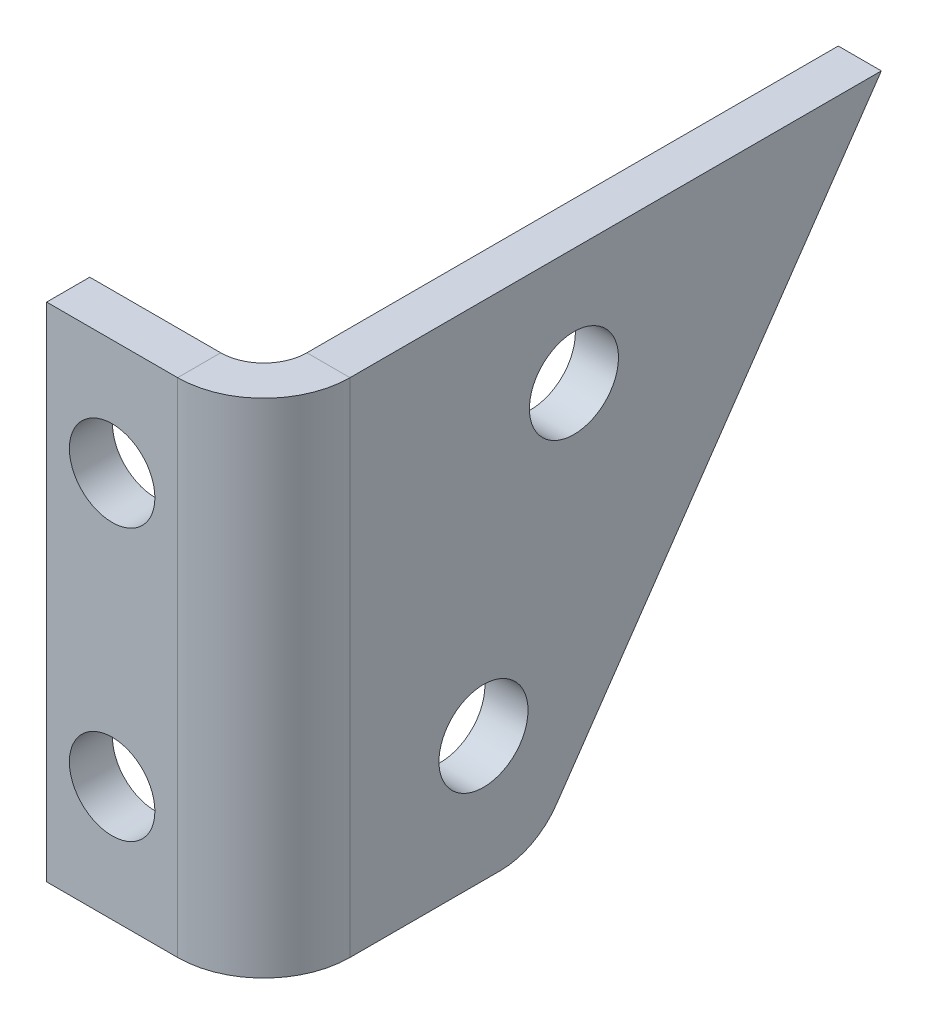
ISO-10303-21;
HEADER;
FILE_DESCRIPTION(('STEP AP214'),'2;1');
FILE_NAME('part.step','',(''),(''),'','','');
FILE_SCHEMA(('AUTOMOTIVE_DESIGN { 1 0 10303 214 1 1 1 1 }'));
ENDSEC;
DATA;
#1=APPLICATION_CONTEXT('core data for automotive mechanical design processes');
#2=APPLICATION_PROTOCOL_DEFINITION('international standard','automotive_design',2000,#1);
#3=PRODUCT_CONTEXT('',#1,'mechanical');
#4=PRODUCT('Part','Part','',(#3));
#5=PRODUCT_RELATED_PRODUCT_CATEGORY('part','',(#4));
#6=PRODUCT_DEFINITION_FORMATION('','',#4);
#7=PRODUCT_DEFINITION_CONTEXT('part definition',#1,'design');
#8=PRODUCT_DEFINITION('design','',#6,#7);
#9=PRODUCT_DEFINITION_SHAPE('','',#8);
#10=(LENGTH_UNIT() NAMED_UNIT(*) SI_UNIT(.MILLI.,.METRE.));
#11=(NAMED_UNIT(*) PLANE_ANGLE_UNIT() SI_UNIT($,.RADIAN.));
#12=(NAMED_UNIT(*) SI_UNIT($,.STERADIAN.) SOLID_ANGLE_UNIT());
#13=UNCERTAINTY_MEASURE_WITH_UNIT(LENGTH_MEASURE(1.E-05),#10,'distance_accuracy_value','');
#14=(GEOMETRIC_REPRESENTATION_CONTEXT(3) GLOBAL_UNCERTAINTY_ASSIGNED_CONTEXT((#13)) GLOBAL_UNIT_ASSIGNED_CONTEXT((#10,
#11,#12)) REPRESENTATION_CONTEXT('',''));
#15=CARTESIAN_POINT('',(0.,0.,0.));
#16=DIRECTION('',(0.,0.,1.));
#17=DIRECTION('',(1.,0.,0.));
#18=AXIS2_PLACEMENT_3D('',#15,#16,#17);
#19=CARTESIAN_POINT('',(-3.175,37.,-50.1590545460921));
#20=DIRECTION('',(0.,1.,0.));
#21=DIRECTION('',(0.,0.,1.));
#22=AXIS2_PLACEMENT_3D('',#19,#20,#21);
#23=PLANE('',#22);
#24=DIRECTION('',(0.,0.,1.));
#25=VECTOR('',#24,1.);
#26=CARTESIAN_POINT('',(-3.175,37.,-50.1590545460921));
#27=LINE('',#26,#25);
#28=CARTESIAN_POINT('',(-3.175,37.,-95.6605073025976));
#29=VERTEX_POINT('',#28);
#30=CARTESIAN_POINT('',(-3.17499999999999,37.,-56.5090545460921));
#31=VERTEX_POINT('',#30);
#32=EDGE_CURVE('E228',#29,#31,#27,.T.);
#33=ORIENTED_EDGE('',*,*,#32,.T.);
#34=DIRECTION('',(1.,0.,0.));
#35=VECTOR('',#34,1.);
#36=CARTESIAN_POINT('',(-3.17499999999999,37.,-56.5090545460921));
#37=LINE('',#36,#35);
#38=CARTESIAN_POINT('',(0.,37.,-56.5090545460921));
#39=VERTEX_POINT('',#38);
#40=EDGE_CURVE('E198',#31,#39,#37,.T.);
#41=ORIENTED_EDGE('',*,*,#40,.T.);
#42=DIRECTION('',(0.,0.,1.));
#43=VECTOR('',#42,1.);
#44=CARTESIAN_POINT('',(0.,37.,-50.1590545460921));
#45=LINE('',#44,#43);
#46=CARTESIAN_POINT('',(0.,37.,-95.6605073025976));
#47=VERTEX_POINT('',#46);
#48=EDGE_CURVE('E223',#47,#39,#45,.T.);
#49=ORIENTED_EDGE('',*,*,#48,.F.);
#50=DIRECTION('',(1.,0.,0.));
#51=VECTOR('',#50,1.);
#52=CARTESIAN_POINT('',(-3.175,37.,-95.6605073025976));
#53=LINE('',#52,#51);
#54=EDGE_CURVE('E13',#29,#47,#53,.T.);
#55=ORIENTED_EDGE('',*,*,#54,.F.);
#56=EDGE_LOOP('',(#33,#41,#49,#55));
#57=FACE_BOUND('',#56,.T.);
#58=ADVANCED_FACE('F63',(#57),#23,.T.);
#59=CARTESIAN_POINT('',(-3.175,5.00000000000016,-67.5979092718288));
#60=DIRECTION('',(1.,0.,0.));
#61=DIRECTION('',(0.,0.,-1.));
#62=AXIS2_PLACEMENT_3D('',#59,#60,#61);
#63=PLANE('',#62);
#64=CARTESIAN_POINT('',(-3.175,28.4055664108271,-73.0098549934206));
#65=DIRECTION('',(1.,0.,0.));
#66=DIRECTION('',(0.,0.,-1.));
#67=AXIS2_PLACEMENT_3D('',#64,#65,#66);
#68=CIRCLE('',#67,3.28245761780859);
#69=CARTESIAN_POINT('',(-3.175,28.4055664108271,-76.2923126112292));
#70=VERTEX_POINT('',#69);
#71=EDGE_CURVE('E215',#70,#70,#68,.T.);
#72=ORIENTED_EDGE('',*,*,#71,.T.);
#73=EDGE_LOOP('',(#72));
#74=FACE_BOUND('',#73,.T.);
#75=CARTESIAN_POINT('',(-3.175,9.22229452648841,-66.344990454787));
#76=DIRECTION('',(1.,0.,0.));
#77=DIRECTION('',(0.,0.,-1.));
#78=AXIS2_PLACEMENT_3D('',#75,#76,#77);
#79=CIRCLE('',#78,3.28245761780857);
#80=CARTESIAN_POINT('',(-3.175,9.22229452648841,-69.6274480725955));
#81=VERTEX_POINT('',#80);
#82=EDGE_CURVE('E209',#81,#81,#79,.T.);
#83=ORIENTED_EDGE('',*,*,#82,.T.);
#84=EDGE_LOOP('',(#83));
#85=FACE_BOUND('',#84,.T.);
#86=DIRECTION('',(0.,1.,0.));
#87=VECTOR('',#86,1.);
#88=CARTESIAN_POINT('',(-3.17499999999999,37.,-56.5090545460921));
#89=LINE('',#88,#87);
#90=CARTESIAN_POINT('',(-3.17499999999999,0.,-56.5090545460921));
#91=VERTEX_POINT('',#90);
#92=EDGE_CURVE('E202',#31,#91,#89,.F.);
#93=ORIENTED_EDGE('',*,*,#92,.F.);
#94=ORIENTED_EDGE('',*,*,#32,.F.);
#95=DIRECTION('',(0.,0.824097746308315,-0.566447618522274));
#96=VECTOR('',#95,1.);
#97=CARTESIAN_POINT('',(-3.175,2.16776190738873,-71.7183980033704));
#98=LINE('',#97,#96);
#99=CARTESIAN_POINT('',(-3.175,2.16776190738873,-71.7183980033704));
#100=VERTEX_POINT('',#99);
#101=EDGE_CURVE('E226',#100,#29,#98,.T.);
#102=ORIENTED_EDGE('',*,*,#101,.F.);
#103=CARTESIAN_POINT('',(-3.175,5.00000000000016,-67.5979092718288));
#104=DIRECTION('',(1.,0.,0.));
#105=DIRECTION('',(0.,0.,-1.));
#106=AXIS2_PLACEMENT_3D('',#103,#104,#105);
#107=CIRCLE('',#106,5.00000000000001);
#108=CARTESIAN_POINT('',(-3.175,1.47451495458029E-13,-67.5979092718288));
#109=VERTEX_POINT('',#108);
#110=EDGE_CURVE('E222',#109,#100,#107,.T.);
#111=ORIENTED_EDGE('',*,*,#110,.F.);
#112=DIRECTION('',(0.,0.,-1.));
#113=VECTOR('',#112,1.);
#114=CARTESIAN_POINT('',(-3.175,0.,-50.1590545460921));
#115=LINE('',#114,#113);
#116=EDGE_CURVE('E109',#91,#109,#115,.T.);
#117=ORIENTED_EDGE('',*,*,#116,.F.);
#118=EDGE_LOOP('',(#93,#94,#102,#111,#117));
#119=FACE_BOUND('',#118,.T.);
#120=ADVANCED_FACE('F251',(#74,#85,#119),#63,.F.);
#121=CARTESIAN_POINT('',(0.,5.00000000000016,-67.5979092718288));
#122=DIRECTION('',(1.,0.,0.));
#123=DIRECTION('',(0.,0.,-1.));
#124=AXIS2_PLACEMENT_3D('',#121,#122,#123);
#125=PLANE('',#124);
#126=CARTESIAN_POINT('',(0.,9.22229452648841,-66.344990454787));
#127=DIRECTION('',(1.,0.,0.));
#128=DIRECTION('',(0.,0.,-1.));
#129=AXIS2_PLACEMENT_3D('',#126,#127,#128);
#130=CIRCLE('',#129,3.28245761780857);
#131=CARTESIAN_POINT('',(0.,9.22229452648841,-69.6274480725955));
#132=VERTEX_POINT('',#131);
#133=EDGE_CURVE('E207',#132,#132,#130,.T.);
#134=ORIENTED_EDGE('',*,*,#133,.F.);
#135=EDGE_LOOP('',(#134));
#136=FACE_BOUND('',#135,.T.);
#137=CARTESIAN_POINT('',(0.,28.4055664108271,-73.0098549934206));
#138=DIRECTION('',(1.,0.,0.));
#139=DIRECTION('',(0.,0.,-1.));
#140=AXIS2_PLACEMENT_3D('',#137,#138,#139);
#141=CIRCLE('',#140,3.28245761780859);
#142=CARTESIAN_POINT('',(0.,28.4055664108271,-76.2923126112292));
#143=VERTEX_POINT('',#142);
#144=EDGE_CURVE('E212',#143,#143,#141,.T.);
#145=ORIENTED_EDGE('',*,*,#144,.F.);
#146=EDGE_LOOP('',(#145));
#147=FACE_BOUND('',#146,.T.);
#148=ORIENTED_EDGE('',*,*,#48,.T.);
#149=DIRECTION('',(0.,1.,0.));
#150=VECTOR('',#149,1.);
#151=CARTESIAN_POINT('',(0.,37.,-56.5090545460921));
#152=LINE('',#151,#150);
#153=CARTESIAN_POINT('',(0.,0.,-56.5090545460921));
#154=VERTEX_POINT('',#153);
#155=EDGE_CURVE('E148',#39,#154,#152,.F.);
#156=ORIENTED_EDGE('',*,*,#155,.T.);
#157=DIRECTION('',(0.,0.,-1.));
#158=VECTOR('',#157,1.);
#159=CARTESIAN_POINT('',(0.,0.,-50.1590545460921));
#160=LINE('',#159,#158);
#161=CARTESIAN_POINT('',(0.,1.47451495458029E-13,-67.5979092718288));
#162=VERTEX_POINT('',#161);
#163=EDGE_CURVE('E218',#154,#162,#160,.T.);
#164=ORIENTED_EDGE('',*,*,#163,.T.);
#165=CARTESIAN_POINT('',(0.,5.00000000000016,-67.5979092718288));
#166=DIRECTION('',(1.,0.,0.));
#167=DIRECTION('',(0.,0.,-1.));
#168=AXIS2_PLACEMENT_3D('',#165,#166,#167);
#169=CIRCLE('',#168,5.00000000000001);
#170=CARTESIAN_POINT('',(0.,2.16776190738873,-71.7183980033704));
#171=VERTEX_POINT('',#170);
#172=EDGE_CURVE('E231',#162,#171,#169,.T.);
#173=ORIENTED_EDGE('',*,*,#172,.T.);
#174=DIRECTION('',(0.,0.824097746308315,-0.566447618522274));
#175=VECTOR('',#174,1.);
#176=CARTESIAN_POINT('',(0.,2.16776190738873,-71.7183980033704));
#177=LINE('',#176,#175);
#178=EDGE_CURVE('E234',#171,#47,#177,.T.);
#179=ORIENTED_EDGE('',*,*,#178,.T.);
#180=EDGE_LOOP('',(#148,#156,#164,#173,#179));
#181=FACE_BOUND('',#180,.T.);
#182=ADVANCED_FACE('F244',(#136,#147,#181),#125,.T.);
#183=CARTESIAN_POINT('',(-3.175,0.,-50.1590545460921));
#184=DIRECTION('',(0.,-1.,0.));
#185=DIRECTION('',(0.,0.,-1.));
#186=AXIS2_PLACEMENT_3D('',#183,#184,#185);
#187=PLANE('',#186);
#188=DIRECTION('',(1.,0.,0.));
#189=VECTOR('',#188,1.);
#190=CARTESIAN_POINT('',(-3.17499999999999,0.,-56.5090545460921));
#191=LINE('',#190,#189);
#192=EDGE_CURVE('E205',#91,#154,#191,.T.);
#193=ORIENTED_EDGE('',*,*,#192,.F.);
#194=ORIENTED_EDGE('',*,*,#116,.T.);
#195=DIRECTION('',(1.,0.,0.));
#196=VECTOR('',#195,1.);
#197=CARTESIAN_POINT('',(-3.175,1.47451495458029E-13,-67.5979092718288));
#198=LINE('',#197,#196);
#199=EDGE_CURVE('E67',#109,#162,#198,.T.);
#200=ORIENTED_EDGE('',*,*,#199,.T.);
#201=ORIENTED_EDGE('',*,*,#163,.F.);
#202=EDGE_LOOP('',(#193,#194,#200,#201));
#203=FACE_BOUND('',#202,.T.);
#204=ADVANCED_FACE('F65',(#203),#187,.T.);
#205=CARTESIAN_POINT('',(-3.175,2.16776190738873,-71.7183980033704));
#206=DIRECTION('',(0.,-0.566447618522274,-0.824097746308315));
#207=DIRECTION('',(0.,0.824097746308315,-0.566447618522274));
#208=AXIS2_PLACEMENT_3D('',#205,#206,#207);
#209=PLANE('',#208);
#210=ORIENTED_EDGE('',*,*,#178,.F.);
#211=DIRECTION('',(1.,0.,0.));
#212=VECTOR('',#211,1.);
#213=CARTESIAN_POINT('',(-3.175,2.16776190738873,-71.7183980033704));
#214=LINE('',#213,#212);
#215=EDGE_CURVE('E72',#100,#171,#214,.T.);
#216=ORIENTED_EDGE('',*,*,#215,.F.);
#217=ORIENTED_EDGE('',*,*,#101,.T.);
#218=ORIENTED_EDGE('',*,*,#54,.T.);
#219=EDGE_LOOP('',(#210,#216,#217,#218));
#220=FACE_BOUND('',#219,.T.);
#221=ADVANCED_FACE('F253',(#220),#209,.T.);
#222=CARTESIAN_POINT('',(-3.175,5.00000000000016,-67.5979092718288));
#223=DIRECTION('',(1.,0.,0.));
#224=DIRECTION('',(0.,0.,-1.));
#225=AXIS2_PLACEMENT_3D('',#222,#223,#224);
#226=CYLINDRICAL_SURFACE('',#225,5.00000000000001);
#227=ORIENTED_EDGE('',*,*,#172,.F.);
#228=ORIENTED_EDGE('',*,*,#199,.F.);
#229=ORIENTED_EDGE('',*,*,#110,.T.);
#230=ORIENTED_EDGE('',*,*,#215,.T.);
#231=EDGE_LOOP('',(#227,#228,#229,#230));
#232=FACE_BOUND('',#231,.T.);
#233=ADVANCED_FACE('F242',(#232),#226,.T.);
#234=CARTESIAN_POINT('',(-3.175,28.4055664108271,-73.0098549934206));
#235=DIRECTION('',(1.,0.,0.));
#236=DIRECTION('',(0.,0.,-1.));
#237=AXIS2_PLACEMENT_3D('',#234,#235,#236);
#238=CYLINDRICAL_SURFACE('',#237,3.28245761780859);
#239=ORIENTED_EDGE('',*,*,#71,.F.);
#240=EDGE_LOOP('',(#239));
#241=FACE_BOUND('',#240,.T.);
#242=ORIENTED_EDGE('',*,*,#144,.T.);
#243=EDGE_LOOP('',(#242));
#244=FACE_BOUND('',#243,.T.);
#245=ADVANCED_FACE('F259',(#241,#244),#238,.F.);
#246=CARTESIAN_POINT('',(-3.175,9.22229452648841,-66.344990454787));
#247=DIRECTION('',(1.,0.,0.));
#248=DIRECTION('',(0.,0.,-1.));
#249=AXIS2_PLACEMENT_3D('',#246,#247,#248);
#250=CYLINDRICAL_SURFACE('',#249,3.28245761780857);
#251=ORIENTED_EDGE('',*,*,#82,.F.);
#252=EDGE_LOOP('',(#251));
#253=FACE_BOUND('',#252,.T.);
#254=ORIENTED_EDGE('',*,*,#133,.T.);
#255=EDGE_LOOP('',(#254));
#256=FACE_BOUND('',#255,.T.);
#257=ADVANCED_FACE('F275',(#253,#256),#250,.F.);
#258=CARTESIAN_POINT('',(-6.34999999999999,0.,-56.5090545460921));
#259=DIRECTION('',(0.,-1.,0.));
#260=DIRECTION('',(0.,0.,-1.));
#261=AXIS2_PLACEMENT_3D('',#258,#259,#260);
#262=PLANE('',#261);
#263=DIRECTION('',(0.,0.,1.));
#264=VECTOR('',#263,1.);
#265=CARTESIAN_POINT('',(-6.34999999999999,0.,-50.159054546092));
#266=LINE('',#265,#264);
#267=CARTESIAN_POINT('',(-6.34999999999998,0.,-53.3340545460921));
#268=VERTEX_POINT('',#267);
#269=CARTESIAN_POINT('',(-6.34999999999997,0.,-50.1590545460921));
#270=VERTEX_POINT('',#269);
#271=EDGE_CURVE('E193',#268,#270,#266,.T.);
#272=ORIENTED_EDGE('',*,*,#271,.F.);
#273=CARTESIAN_POINT('',(-6.34999999999999,0.,-56.5090545460921));
#274=DIRECTION('',(0.,1.,0.));
#275=DIRECTION('',(0.,0.,1.));
#276=AXIS2_PLACEMENT_3D('',#273,#274,#275);
#277=CIRCLE('',#276,3.175);
#278=EDGE_CURVE('E151',#91,#268,#277,.F.);
#279=ORIENTED_EDGE('',*,*,#278,.F.);
#280=ORIENTED_EDGE('',*,*,#192,.T.);
#281=CARTESIAN_POINT('',(-6.34999999999999,0.,-56.5090545460921));
#282=DIRECTION('',(0.,1.,0.));
#283=DIRECTION('',(0.,0.,1.));
#284=AXIS2_PLACEMENT_3D('',#281,#282,#283);
#285=CIRCLE('',#284,6.35);
#286=EDGE_CURVE('E80',#154,#270,#285,.F.);
#287=ORIENTED_EDGE('',*,*,#286,.T.);
#288=EDGE_LOOP('',(#272,#279,#280,#287));
#289=FACE_BOUND('',#288,.T.);
#290=ADVANCED_FACE('F278',(#289),#262,.T.);
#291=CARTESIAN_POINT('',(-6.34999999999999,37.,-56.5090545460921));
#292=DIRECTION('',(0.,-1.,0.));
#293=DIRECTION('',(0.,0.,-1.));
#294=AXIS2_PLACEMENT_3D('',#291,#292,#293);
#295=PLANE('',#294);
#296=CARTESIAN_POINT('',(-6.34999999999999,37.,-56.5090545460921));
#297=DIRECTION('',(0.,1.,0.));
#298=DIRECTION('',(0.,0.,1.));
#299=AXIS2_PLACEMENT_3D('',#296,#297,#298);
#300=CIRCLE('',#299,3.175);
#301=CARTESIAN_POINT('',(-6.34999999999998,37.,-53.3340545460921));
#302=VERTEX_POINT('',#301);
#303=EDGE_CURVE('E158',#302,#31,#300,.T.);
#304=ORIENTED_EDGE('',*,*,#303,.F.);
#305=DIRECTION('',(0.,0.,1.));
#306=VECTOR('',#305,1.);
#307=CARTESIAN_POINT('',(-6.34999999999999,37.,-53.3340545460921));
#308=LINE('',#307,#306);
#309=CARTESIAN_POINT('',(-6.34999999999999,37.,-50.1590545460921));
#310=VERTEX_POINT('',#309);
#311=EDGE_CURVE('E155',#302,#310,#308,.T.);
#312=ORIENTED_EDGE('',*,*,#311,.T.);
#313=CARTESIAN_POINT('',(-6.34999999999999,37.,-56.5090545460921));
#314=DIRECTION('',(0.,1.,0.));
#315=DIRECTION('',(0.,0.,1.));
#316=AXIS2_PLACEMENT_3D('',#313,#314,#315);
#317=CIRCLE('',#316,6.35);
#318=EDGE_CURVE('E142',#310,#39,#317,.T.);
#319=ORIENTED_EDGE('',*,*,#318,.T.);
#320=ORIENTED_EDGE('',*,*,#40,.F.);
#321=EDGE_LOOP('',(#304,#312,#319,#320));
#322=FACE_BOUND('',#321,.T.);
#323=ADVANCED_FACE('F156',(#322),#295,.F.);
#324=CARTESIAN_POINT('',(-6.34999999999999,37.,-56.5090545460921));
#325=DIRECTION('',(0.,1.,0.));
#326=DIRECTION('',(0.,0.,1.));
#327=AXIS2_PLACEMENT_3D('',#324,#325,#326);
#328=CYLINDRICAL_SURFACE('',#327,6.35);
#329=ORIENTED_EDGE('',*,*,#155,.F.);
#330=ORIENTED_EDGE('',*,*,#318,.F.);
#331=DIRECTION('',(0.,1.,0.));
#332=VECTOR('',#331,1.);
#333=CARTESIAN_POINT('',(-6.34999999999999,0.,-50.1590545460921));
#334=LINE('',#333,#332);
#335=EDGE_CURVE('E146',#270,#310,#334,.T.);
#336=ORIENTED_EDGE('',*,*,#335,.F.);
#337=ORIENTED_EDGE('',*,*,#286,.F.);
#338=EDGE_LOOP('',(#329,#330,#336,#337));
#339=FACE_BOUND('',#338,.T.);
#340=ADVANCED_FACE('F144',(#339),#328,.T.);
#341=CARTESIAN_POINT('',(-6.34999999999999,37.,-56.5090545460921));
#342=DIRECTION('',(0.,1.,0.));
#343=DIRECTION('',(0.,0.,1.));
#344=AXIS2_PLACEMENT_3D('',#341,#342,#343);
#345=CYLINDRICAL_SURFACE('',#344,3.175);
#346=ORIENTED_EDGE('',*,*,#92,.T.);
#347=ORIENTED_EDGE('',*,*,#278,.T.);
#348=DIRECTION('',(0.,-1.,0.));
#349=VECTOR('',#348,1.);
#350=CARTESIAN_POINT('',(-6.34999999999999,0.,-53.3340545460921));
#351=LINE('',#350,#349);
#352=EDGE_CURVE('E163',#268,#302,#351,.F.);
#353=ORIENTED_EDGE('',*,*,#352,.T.);
#354=ORIENTED_EDGE('',*,*,#303,.T.);
#355=EDGE_LOOP('',(#346,#347,#353,#354));
#356=FACE_BOUND('',#355,.T.);
#357=ADVANCED_FACE('F247',(#356),#345,.F.);
#358=CARTESIAN_POINT('',(-3.17499999999999,37.,-50.1590545460921));
#359=DIRECTION('',(0.,1.,0.));
#360=DIRECTION('',(0.,0.,1.));
#361=AXIS2_PLACEMENT_3D('',#358,#359,#360);
#362=PLANE('',#361);
#363=DIRECTION('',(1.,0.,0.));
#364=VECTOR('',#363,1.);
#365=CARTESIAN_POINT('',(-3.17499999999999,37.,-50.1590545460921));
#366=LINE('',#365,#364);
#367=CARTESIAN_POINT('',(-16.,37.,-50.159054546092));
#368=VERTEX_POINT('',#367);
#369=EDGE_CURVE('E170',#368,#310,#366,.T.);
#370=ORIENTED_EDGE('',*,*,#369,.T.);
#371=ORIENTED_EDGE('',*,*,#311,.F.);
#372=DIRECTION('',(-1.,0.,0.));
#373=VECTOR('',#372,1.);
#374=CARTESIAN_POINT('',(-1.62829641083335E-13,37.,-53.3340545460921));
#375=LINE('',#374,#373);
#376=CARTESIAN_POINT('',(-16.,37.,-53.334054546092));
#377=VERTEX_POINT('',#376);
#378=EDGE_CURVE('E186',#377,#302,#375,.F.);
#379=ORIENTED_EDGE('',*,*,#378,.F.);
#380=DIRECTION('',(0.,0.,-1.));
#381=VECTOR('',#380,1.);
#382=CARTESIAN_POINT('',(-16.,37.,-50.159054546092));
#383=LINE('',#382,#381);
#384=EDGE_CURVE('E175',#368,#377,#383,.T.);
#385=ORIENTED_EDGE('',*,*,#384,.F.);
#386=EDGE_LOOP('',(#370,#371,#379,#385));
#387=FACE_BOUND('',#386,.T.);
#388=ADVANCED_FACE('F174',(#387),#362,.T.);
#389=CARTESIAN_POINT('',(-16.,0.,-50.159054546092));
#390=DIRECTION('',(0.,-1.,0.));
#391=DIRECTION('',(0.,0.,-1.));
#392=AXIS2_PLACEMENT_3D('',#389,#390,#391);
#393=PLANE('',#392);
#394=DIRECTION('',(1.,0.,0.));
#395=VECTOR('',#394,1.);
#396=CARTESIAN_POINT('',(-1.62829641083335E-13,0.,-53.3340545460921));
#397=LINE('',#396,#395);
#398=CARTESIAN_POINT('',(-16.,0.,-53.334054546092));
#399=VERTEX_POINT('',#398);
#400=EDGE_CURVE('E172',#268,#399,#397,.F.);
#401=ORIENTED_EDGE('',*,*,#400,.F.);
#402=ORIENTED_EDGE('',*,*,#271,.T.);
#403=DIRECTION('',(-1.,0.,0.));
#404=VECTOR('',#403,1.);
#405=CARTESIAN_POINT('',(-16.,0.,-50.159054546092));
#406=LINE('',#405,#404);
#407=CARTESIAN_POINT('',(-16.,0.,-50.159054546092));
#408=VERTEX_POINT('',#407);
#409=EDGE_CURVE('E171',#270,#408,#406,.T.);
#410=ORIENTED_EDGE('',*,*,#409,.T.);
#411=DIRECTION('',(0.,0.,-1.));
#412=VECTOR('',#411,1.);
#413=CARTESIAN_POINT('',(-16.,0.,-50.159054546092));
#414=LINE('',#413,#412);
#415=EDGE_CURVE('E177',#408,#399,#414,.T.);
#416=ORIENTED_EDGE('',*,*,#415,.T.);
#417=EDGE_LOOP('',(#401,#402,#410,#416));
#418=FACE_BOUND('',#417,.T.);
#419=ADVANCED_FACE('F289',(#418),#393,.T.);
#420=CARTESIAN_POINT('',(-1.51744187832508E-13,0.,-50.1590545460921));
#421=DIRECTION('',(0.,0.,1.));
#422=DIRECTION('',(1.,0.,0.));
#423=AXIS2_PLACEMENT_3D('',#420,#421,#422);
#424=PLANE('',#423);
#425=CARTESIAN_POINT('',(-11.175,28.5,-50.1590545460921));
#426=DIRECTION('',(0.,0.,1.));
#427=DIRECTION('',(1.,0.,0.));
#428=AXIS2_PLACEMENT_3D('',#425,#426,#427);
#429=CIRCLE('',#428,3.15);
#430=CARTESIAN_POINT('',(-8.025,28.5,-50.1590545460921));
#431=VERTEX_POINT('',#430);
#432=EDGE_CURVE('E196',#431,#431,#429,.T.);
#433=ORIENTED_EDGE('',*,*,#432,.F.);
#434=EDGE_LOOP('',(#433));
#435=FACE_BOUND('',#434,.T.);
#436=CARTESIAN_POINT('',(-11.175,8.5,-50.1590545460921));
#437=DIRECTION('',(0.,0.,1.));
#438=DIRECTION('',(1.,0.,0.));
#439=AXIS2_PLACEMENT_3D('',#436,#437,#438);
#440=CIRCLE('',#439,3.15);
#441=CARTESIAN_POINT('',(-8.025,8.5,-50.1590545460921));
#442=VERTEX_POINT('',#441);
#443=EDGE_CURVE('E321',#442,#442,#440,.T.);
#444=ORIENTED_EDGE('',*,*,#443,.F.);
#445=EDGE_LOOP('',(#444));
#446=FACE_BOUND('',#445,.T.);
#447=ORIENTED_EDGE('',*,*,#409,.F.);
#448=ORIENTED_EDGE('',*,*,#335,.T.);
#449=ORIENTED_EDGE('',*,*,#369,.F.);
#450=DIRECTION('',(0.,1.,0.));
#451=VECTOR('',#450,1.);
#452=CARTESIAN_POINT('',(-16.,37.,-50.159054546092));
#453=LINE('',#452,#451);
#454=EDGE_CURVE('E178',#408,#368,#453,.T.);
#455=ORIENTED_EDGE('',*,*,#454,.F.);
#456=EDGE_LOOP('',(#447,#448,#449,#455));
#457=FACE_BOUND('',#456,.T.);
#458=ADVANCED_FACE('F168',(#435,#446,#457),#424,.T.);
#459=CARTESIAN_POINT('',(-1.62829641083335E-13,0.,-53.3340545460921));
#460=DIRECTION('',(0.,0.,1.));
#461=DIRECTION('',(1.,0.,0.));
#462=AXIS2_PLACEMENT_3D('',#459,#460,#461);
#463=PLANE('',#462);
#464=CARTESIAN_POINT('',(-11.175,28.5,-53.3340545460921));
#465=DIRECTION('',(0.,0.,-1.));
#466=DIRECTION('',(-1.,0.,0.));
#467=AXIS2_PLACEMENT_3D('',#464,#465,#466);
#468=CIRCLE('',#467,3.15);
#469=CARTESIAN_POINT('',(-14.325,28.5,-53.3340545460921));
#470=VERTEX_POINT('',#469);
#471=EDGE_CURVE('E320',#470,#470,#468,.T.);
#472=ORIENTED_EDGE('',*,*,#471,.F.);
#473=EDGE_LOOP('',(#472));
#474=FACE_BOUND('',#473,.T.);
#475=CARTESIAN_POINT('',(-11.175,8.5,-53.3340545460921));
#476=DIRECTION('',(0.,0.,-1.));
#477=DIRECTION('',(-1.,0.,0.));
#478=AXIS2_PLACEMENT_3D('',#475,#476,#477);
#479=CIRCLE('',#478,3.15);
#480=CARTESIAN_POINT('',(-14.325,8.5,-53.3340545460921));
#481=VERTEX_POINT('',#480);
#482=EDGE_CURVE('E322',#481,#481,#479,.T.);
#483=ORIENTED_EDGE('',*,*,#482,.F.);
#484=EDGE_LOOP('',(#483));
#485=FACE_BOUND('',#484,.T.);
#486=ORIENTED_EDGE('',*,*,#352,.F.);
#487=ORIENTED_EDGE('',*,*,#400,.T.);
#488=DIRECTION('',(0.,-1.,0.));
#489=VECTOR('',#488,1.);
#490=CARTESIAN_POINT('',(-16.,0.,-53.334054546092));
#491=LINE('',#490,#489);
#492=EDGE_CURVE('E188',#399,#377,#491,.F.);
#493=ORIENTED_EDGE('',*,*,#492,.T.);
#494=ORIENTED_EDGE('',*,*,#378,.T.);
#495=EDGE_LOOP('',(#486,#487,#493,#494));
#496=FACE_BOUND('',#495,.T.);
#497=ADVANCED_FACE('F297',(#474,#485,#496),#463,.F.);
#498=CARTESIAN_POINT('',(-16.,37.,-50.159054546092));
#499=DIRECTION('',(-1.,0.,0.));
#500=DIRECTION('',(0.,0.,1.));
#501=AXIS2_PLACEMENT_3D('',#498,#499,#500);
#502=PLANE('',#501);
#503=ORIENTED_EDGE('',*,*,#492,.F.);
#504=ORIENTED_EDGE('',*,*,#415,.F.);
#505=ORIENTED_EDGE('',*,*,#454,.T.);
#506=ORIENTED_EDGE('',*,*,#384,.T.);
#507=EDGE_LOOP('',(#503,#504,#505,#506));
#508=FACE_BOUND('',#507,.T.);
#509=ADVANCED_FACE('F293',(#508),#502,.T.);
#510=CARTESIAN_POINT('',(-11.175,8.5,-43.3340545460921));
#511=DIRECTION('',(0.,0.,-1.));
#512=DIRECTION('',(-1.,0.,0.));
#513=AXIS2_PLACEMENT_3D('',#510,#511,#512);
#514=CYLINDRICAL_SURFACE('',#513,3.15);
#515=ORIENTED_EDGE('',*,*,#443,.T.);
#516=EDGE_LOOP('',(#515));
#517=FACE_BOUND('',#516,.T.);
#518=ORIENTED_EDGE('',*,*,#482,.T.);
#519=EDGE_LOOP('',(#518));
#520=FACE_BOUND('',#519,.T.);
#521=ADVANCED_FACE('F296',(#517,#520),#514,.F.);
#522=CARTESIAN_POINT('',(-11.175,28.5,-43.3340545460921));
#523=DIRECTION('',(0.,0.,-1.));
#524=DIRECTION('',(-1.,0.,0.));
#525=AXIS2_PLACEMENT_3D('',#522,#523,#524);
#526=CYLINDRICAL_SURFACE('',#525,3.15);
#527=ORIENTED_EDGE('',*,*,#432,.T.);
#528=EDGE_LOOP('',(#527));
#529=FACE_BOUND('',#528,.T.);
#530=ORIENTED_EDGE('',*,*,#471,.T.);
#531=EDGE_LOOP('',(#530));
#532=FACE_BOUND('',#531,.T.);
#533=ADVANCED_FACE('F309',(#529,#532),#526,.F.);
#534=CLOSED_SHELL('',(#58,#120,#182,#204,#221,#233,#245,#257,#290,#323,#340,#357,#388,#419,#458,
#497,#509,#521,#533));
#535=MANIFOLD_SOLID_BREP('B2',#534);
#536=ADVANCED_BREP_SHAPE_REPRESENTATION('',(#18,#535),#14);
#537=SHAPE_DEFINITION_REPRESENTATION(#9,#536);
ENDSEC;
END-ISO-10303-21;
